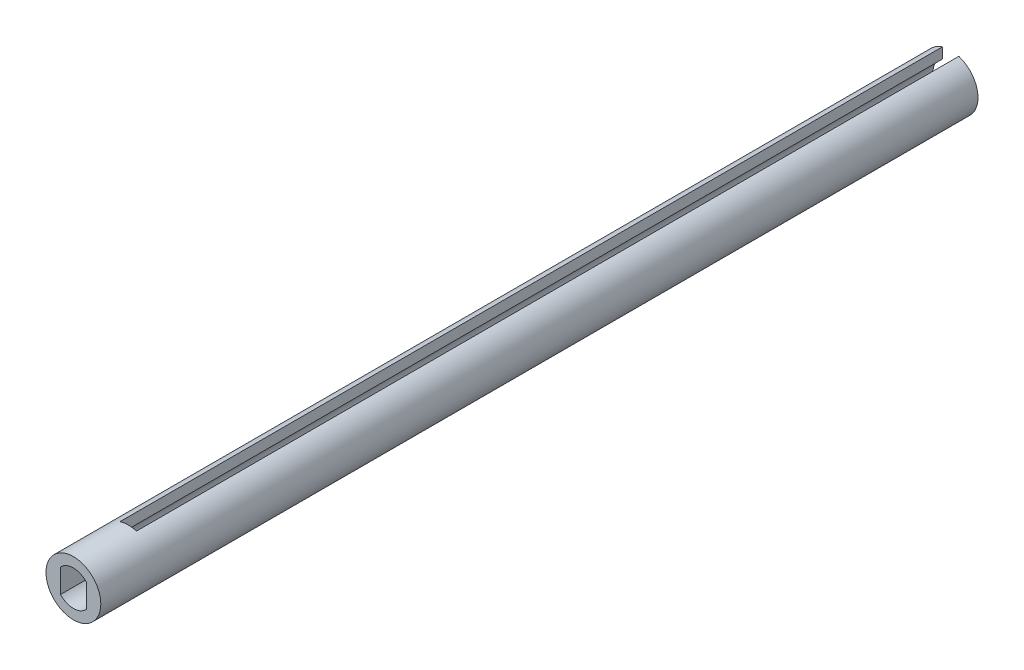
ISO-10303-21;
HEADER;
FILE_DESCRIPTION(('STEP AP214'),'2;1');
FILE_NAME('part.step','',(''),(''),'','','');
FILE_SCHEMA(('AUTOMOTIVE_DESIGN { 1 0 10303 214 1 1 1 1 }'));
ENDSEC;
DATA;
#1=APPLICATION_CONTEXT('core data for automotive mechanical design processes');
#2=APPLICATION_PROTOCOL_DEFINITION('international standard','automotive_design',2000,#1);
#3=PRODUCT_CONTEXT('',#1,'mechanical');
#4=PRODUCT('Part','Part','',(#3));
#5=PRODUCT_RELATED_PRODUCT_CATEGORY('part','',(#4));
#6=PRODUCT_DEFINITION_FORMATION('','',#4);
#7=PRODUCT_DEFINITION_CONTEXT('part definition',#1,'design');
#8=PRODUCT_DEFINITION('design','',#6,#7);
#9=PRODUCT_DEFINITION_SHAPE('','',#8);
#10=(LENGTH_UNIT() NAMED_UNIT(*) SI_UNIT(.MILLI.,.METRE.));
#11=(NAMED_UNIT(*) PLANE_ANGLE_UNIT() SI_UNIT($,.RADIAN.));
#12=(NAMED_UNIT(*) SI_UNIT($,.STERADIAN.) SOLID_ANGLE_UNIT());
#13=UNCERTAINTY_MEASURE_WITH_UNIT(LENGTH_MEASURE(1.E-05),#10,'distance_accuracy_value','');
#14=(GEOMETRIC_REPRESENTATION_CONTEXT(3) GLOBAL_UNCERTAINTY_ASSIGNED_CONTEXT((#13)) GLOBAL_UNIT_ASSIGNED_CONTEXT((#10,
#11,#12)) REPRESENTATION_CONTEXT('',''));
#15=CARTESIAN_POINT('',(0.,0.,0.));
#16=DIRECTION('',(0.,0.,1.));
#17=DIRECTION('',(1.,0.,0.));
#18=AXIS2_PLACEMENT_3D('',#15,#16,#17);
#19=CARTESIAN_POINT('',(0.,0.,0.));
#20=DIRECTION('',(0.,0.,1.));
#21=DIRECTION('',(1.,0.,0.));
#22=AXIS2_PLACEMENT_3D('',#19,#20,#21);
#23=PLANE('',#22);
#24=DIRECTION('',(0.,1.,0.));
#25=VECTOR('',#24,1.);
#26=CARTESIAN_POINT('',(1.5,0.,0.));
#27=LINE('',#26,#25);
#28=CARTESIAN_POINT('',(1.5,2.82665880502051,0.));
#29=VERTEX_POINT('',#28);
#30=CARTESIAN_POINT('',(1.5,4.76969600708473,0.));
#31=VERTEX_POINT('',#30);
#32=EDGE_CURVE('E129',#29,#31,#27,.T.);
#33=ORIENTED_EDGE('',*,*,#32,.T.);
#34=CARTESIAN_POINT('',(0.,0.,0.));
#35=DIRECTION('',(0.,0.,1.));
#36=DIRECTION('',(1.,0.,0.));
#37=AXIS2_PLACEMENT_3D('',#34,#35,#36);
#38=CIRCLE('',#37,5.);
#39=CARTESIAN_POINT('',(-1.5,4.76969600708473,0.));
#40=VERTEX_POINT('',#39);
#41=EDGE_CURVE('E163',#40,#31,#38,.T.);
#42=ORIENTED_EDGE('',*,*,#41,.F.);
#43=DIRECTION('',(0.,1.,0.));
#44=VECTOR('',#43,1.);
#45=CARTESIAN_POINT('',(-1.5,0.,0.));
#46=LINE('',#45,#44);
#47=CARTESIAN_POINT('',(-1.5,2.82665880502051,0.));
#48=VERTEX_POINT('',#47);
#49=EDGE_CURVE('E147',#48,#40,#46,.T.);
#50=ORIENTED_EDGE('',*,*,#49,.F.);
#51=CARTESIAN_POINT('',(0.,0.,0.));
#52=DIRECTION('',(0.,0.,1.));
#53=DIRECTION('',(1.,0.,0.));
#54=AXIS2_PLACEMENT_3D('',#51,#52,#53);
#55=CIRCLE('',#54,3.2);
#56=EDGE_CURVE('E135',#48,#29,#55,.T.);
#57=ORIENTED_EDGE('',*,*,#56,.T.);
#58=EDGE_LOOP('',(#33,#42,#50,#57));
#59=FACE_BOUND('',#58,.T.);
#60=ADVANCED_FACE('F47',(#59),#23,.F.);
#61=CARTESIAN_POINT('',(0.,0.,160.));
#62=DIRECTION('',(0.,0.,-1.));
#63=DIRECTION('',(-1.,0.,0.));
#64=AXIS2_PLACEMENT_3D('',#61,#62,#63);
#65=CYLINDRICAL_SURFACE('',#64,3.2);
#66=DIRECTION('',(0.,0.,-1.));
#67=VECTOR('',#66,1.);
#68=CARTESIAN_POINT('',(-2.35,2.17198066289735,160.));
#69=LINE('',#68,#67);
#70=CARTESIAN_POINT('',(-2.35,2.17198066289735,160.));
#71=VERTEX_POINT('',#70);
#72=CARTESIAN_POINT('',(-2.35,2.17198066289735,155.));
#73=VERTEX_POINT('',#72);
#74=EDGE_CURVE('E190',#71,#73,#69,.T.);
#75=ORIENTED_EDGE('',*,*,#74,.T.);
#76=CARTESIAN_POINT('',(-2.35,2.17198066289735,155.));
#77=CARTESIAN_POINT('',(-2.3499859631665,2.17196010913624,154.911714794234));
#78=CARTESIAN_POINT('',(-2.35233780267795,2.16944986870975,154.823423540656));
#79=CARTESIAN_POINT('',(-2.36167642687595,2.15929935983636,154.647342900407));
#80=CARTESIAN_POINT('',(-2.36866534656167,2.1516567283201,154.559553763709));
#81=CARTESIAN_POINT('',(-2.38727129151564,2.13099040907326,154.384224311997));
#82=CARTESIAN_POINT('',(-2.39893271426384,2.11791505498161,154.296694741332));
#83=CARTESIAN_POINT('',(-2.42666289015235,2.0860862607106,154.123388224814));
#84=CARTESIAN_POINT('',(-2.44273110053114,2.06733351975644,154.037611064523));
#85=CARTESIAN_POINT('',(-2.47902451295939,2.02367145338698,153.868126096642));
#86=CARTESIAN_POINT('',(-2.49926689973569,1.99873658798206,153.784428499551));
#87=CARTESIAN_POINT('',(-2.54338186881744,1.94229035924432,153.620274370416));
#88=CARTESIAN_POINT('',(-2.56725376915858,1.91078023095141,153.539817233094));
#89=CARTESIAN_POINT('',(-2.61785636015724,1.84083715326848,153.383354704468));
#90=CARTESIAN_POINT('',(-2.64457375691501,1.80243586789129,153.307330975165));
#91=CARTESIAN_POINT('',(-2.70006042452642,1.71820121535684,153.160370850191));
#92=CARTESIAN_POINT('',(-2.72882857563894,1.67237188686704,153.089431720056));
#93=CARTESIAN_POINT('',(-2.79756457768102,1.55553491445947,152.929917164909));
#94=CARTESIAN_POINT('',(-2.8379403557815,1.48131962901204,152.843815561099));
#95=CARTESIAN_POINT('',(-2.91710899444124,1.31857447197341,152.685406221096));
#96=CARTESIAN_POINT('',(-2.95590186239014,1.2300446672175,152.613098420503));
#97=CARTESIAN_POINT('',(-3.02830498824864,1.03915533030119,152.484356291823));
#98=CARTESIAN_POINT('',(-3.06187794591266,0.936705264679369,152.428034028228));
#99=CARTESIAN_POINT('',(-3.11965610748052,0.72119609209978,152.33405247564));
#100=CARTESIAN_POINT('',(-3.14387408266794,0.608151712373652,152.296367723137));
#101=CARTESIAN_POINT('',(-3.17440563669275,0.411976917455189,152.249561455427));
#102=CARTESIAN_POINT('',(-3.18395044409229,0.330554755965595,152.235192013338));
#103=CARTESIAN_POINT('',(-3.19674969915326,0.166099734315912,152.216001814944));
#104=CARTESIAN_POINT('',(-3.20000438725172,0.0830669358442565,152.211180693659));
#105=CARTESIAN_POINT('',(-3.19999420978506,-0.109630229456301,152.21118615179));
#106=CARTESIAN_POINT('',(-3.19431168397622,-0.219319920206776,152.219590899992));
#107=CARTESIAN_POINT('',(-3.17214693596162,-0.43505358215682,152.253014773771));
#108=CARTESIAN_POINT('',(-3.15565608777014,-0.541094570168152,152.27804716988));
#109=CARTESIAN_POINT('',(-3.1136170024631,-0.745845591648613,152.343956560529));
#110=CARTESIAN_POINT('',(-3.08809468792635,-0.844575638697687,152.384788238185));
#111=CARTESIAN_POINT('',(-3.03047231961144,-1.03242669810895,152.481109328255));
#112=CARTESIAN_POINT('',(-2.99837266564944,-1.12154829403691,152.536597849784));
#113=CARTESIAN_POINT('',(-2.93084005017882,-1.28769165170331,152.659935560569));
#114=CARTESIAN_POINT('',(-2.89544492049138,-1.36482882646534,152.727651232791));
#115=CARTESIAN_POINT('',(-2.82380561888736,-1.50748266179156,152.873924147776));
#116=CARTESIAN_POINT('',(-2.78756127702215,-1.57299697345059,152.9524835763));
#117=CARTESIAN_POINT('',(-2.71147648046165,-1.70124949931657,153.130571241499));
#118=CARTESIAN_POINT('',(-2.67187970092407,-1.7621980694888,153.231487423553));
#119=CARTESIAN_POINT('',(-2.59754164541057,-1.87004623626055,153.442225409882));
#120=CARTESIAN_POINT('',(-2.56280461553665,-1.91693358756802,153.552054871203));
#121=CARTESIAN_POINT('',(-2.49391728934554,-2.00603415845482,153.800733946871));
#122=CARTESIAN_POINT('',(-2.46126829169268,-2.04544600452006,153.941000096009));
#123=CARTESIAN_POINT('',(-2.40792314779446,-2.1079832690676,154.227278564585));
#124=CARTESIAN_POINT('',(-2.38722808043476,-2.13110721754923,154.373291401413));
#125=CARTESIAN_POINT('',(-2.3653767323975,-2.15525121287874,154.600092404938));
#126=CARTESIAN_POINT('',(-2.35961136454837,-2.16154656633332,154.679941780776));
#127=CARTESIAN_POINT('',(-2.35192507625534,-2.16989943345234,154.839854377547));
#128=CARTESIAN_POINT('',(-2.34999496614196,-2.17196707748656,154.919916625912));
#129=CARTESIAN_POINT('',(-2.35,-2.17198066289735,155.));
#130=B_SPLINE_CURVE_WITH_KNOTS('',3,(#76,#77,#78,#79,#80,#81,#82,#83,#84,#85,#86,#87,#88,#89,
#90,#91,#92,#93,#94,#95,#96,#97,#98,#99,#100,#101,#102,#103,#104,#105,#106,#107,#108,#109,#110,
#111,#112,#113,#114,#115,#116,#117,#118,#119,#120,#121,#122,#123,#124,#125,#126,#127,#128,#129),
.UNSPECIFIED.,.F.,.F.,(4,2,2,2,2,2,2,2,2,2,2,2,2,2,2,2,2,2,2,2,2,2,2,2,2,2,4),(0.,
0.264798466458638,0.529718935807124,0.797218713400203,1.06468555919648,1.33327635129154,
1.60181673897781,1.86915341896077,2.13634523114305,2.49668994422118,2.85703297487835,
3.21984303779325,3.58215603238182,3.83109628792892,4.08002702765666,4.40856128545382,
4.73735806209697,5.06521866350783,5.39305934119418,5.71751560394562,6.04203736269197,
6.41375872107456,6.78580286130069,7.23211364795381,7.67846470948686,7.91919873435269,
8.15935523696815),.UNSPECIFIED.);
#131=CARTESIAN_POINT('',(-2.35,-2.17198066289735,155.));
#132=VERTEX_POINT('',#131);
#133=EDGE_CURVE('E62',#73,#132,#130,.T.);
#134=ORIENTED_EDGE('',*,*,#133,.T.);
#135=DIRECTION('',(0.,0.,-1.));
#136=VECTOR('',#135,1.);
#137=CARTESIAN_POINT('',(-2.35,-2.17198066289735,160.));
#138=LINE('',#137,#136);
#139=CARTESIAN_POINT('',(-2.35,-2.17198066289735,160.));
#140=VERTEX_POINT('',#139);
#141=EDGE_CURVE('E175',#140,#132,#138,.T.);
#142=ORIENTED_EDGE('',*,*,#141,.F.);
#143=CARTESIAN_POINT('',(0.,0.,160.));
#144=DIRECTION('',(0.,0.,1.));
#145=DIRECTION('',(1.,0.,0.));
#146=AXIS2_PLACEMENT_3D('',#143,#144,#145);
#147=CIRCLE('',#146,3.2);
#148=CARTESIAN_POINT('',(2.35,-2.17198066289735,160.));
#149=VERTEX_POINT('',#148);
#150=EDGE_CURVE('E168',#140,#149,#147,.T.);
#151=ORIENTED_EDGE('',*,*,#150,.T.);
#152=DIRECTION('',(0.,0.,-1.));
#153=VECTOR('',#152,1.);
#154=CARTESIAN_POINT('',(2.35,-2.17198066289735,160.));
#155=LINE('',#154,#153);
#156=CARTESIAN_POINT('',(2.35,-2.17198066289735,155.));
#157=VERTEX_POINT('',#156);
#158=EDGE_CURVE('E184',#149,#157,#155,.T.);
#159=ORIENTED_EDGE('',*,*,#158,.T.);
#160=CARTESIAN_POINT('',(2.35,-2.17198066289735,155.));
#161=CARTESIAN_POINT('',(2.3499859631665,-2.17196010913624,154.911714794234));
#162=CARTESIAN_POINT('',(2.35233780267795,-2.16944986870975,154.823423540656));
#163=CARTESIAN_POINT('',(2.36167642687595,-2.15929935983636,154.647342900407));
#164=CARTESIAN_POINT('',(2.36866534656167,-2.1516567283201,154.559553763709));
#165=CARTESIAN_POINT('',(2.38727129151564,-2.13099040907326,154.384224311997));
#166=CARTESIAN_POINT('',(2.39893271426384,-2.11791505498161,154.296694741332));
#167=CARTESIAN_POINT('',(2.42666289015235,-2.0860862607106,154.123388224814));
#168=CARTESIAN_POINT('',(2.44273110053114,-2.06733351975644,154.037611064523));
#169=CARTESIAN_POINT('',(2.47902451295939,-2.02367145338698,153.868126096642));
#170=CARTESIAN_POINT('',(2.49926689973569,-1.99873658798206,153.784428499551));
#171=CARTESIAN_POINT('',(2.54338186881744,-1.94229035924432,153.620274370416));
#172=CARTESIAN_POINT('',(2.56725376915858,-1.91078023095141,153.539817233094));
#173=CARTESIAN_POINT('',(2.61785636015724,-1.84083715326848,153.383354704468));
#174=CARTESIAN_POINT('',(2.64457375691501,-1.80243586789129,153.307330975165));
#175=CARTESIAN_POINT('',(2.70006042452642,-1.71820121535684,153.160370850191));
#176=CARTESIAN_POINT('',(2.72882857563894,-1.67237188686704,153.089431720056));
#177=CARTESIAN_POINT('',(2.79756457768102,-1.55553491445947,152.929917164909));
#178=CARTESIAN_POINT('',(2.8379403557815,-1.48131962901204,152.843815561099));
#179=CARTESIAN_POINT('',(2.91710899444124,-1.31857447197341,152.685406221096));
#180=CARTESIAN_POINT('',(2.95590186239014,-1.2300446672175,152.613098420503));
#181=CARTESIAN_POINT('',(3.02830498824864,-1.03915533030119,152.484356291823));
#182=CARTESIAN_POINT('',(3.06187794591266,-0.936705264679369,152.428034028228));
#183=CARTESIAN_POINT('',(3.11965610748052,-0.721196092099781,152.33405247564));
#184=CARTESIAN_POINT('',(3.14387408266794,-0.608151712373653,152.296367723137));
#185=CARTESIAN_POINT('',(3.17440563669275,-0.411976917455189,152.249561455427));
#186=CARTESIAN_POINT('',(3.18395044409229,-0.330554755965595,152.235192013338));
#187=CARTESIAN_POINT('',(3.19674969915326,-0.166099734315912,152.216001814944));
#188=CARTESIAN_POINT('',(3.20000438725172,-0.0830669358442568,152.211180693659));
#189=CARTESIAN_POINT('',(3.19999420978506,0.109630229456299,152.21118615179));
#190=CARTESIAN_POINT('',(3.19431168397622,0.219319920206773,152.219590899992));
#191=CARTESIAN_POINT('',(3.17214693596162,0.435053582156817,152.253014773771));
#192=CARTESIAN_POINT('',(3.15565608777014,0.541094570168151,152.27804716988));
#193=CARTESIAN_POINT('',(3.1136170024631,0.745845591648613,152.343956560529));
#194=CARTESIAN_POINT('',(3.08809468792635,0.844575638697686,152.384788238185));
#195=CARTESIAN_POINT('',(3.03047231961144,1.03242669810895,152.481109328255));
#196=CARTESIAN_POINT('',(2.99837266564944,1.12154829403691,152.536597849784));
#197=CARTESIAN_POINT('',(2.93084005017882,1.28769165170331,152.659935560569));
#198=CARTESIAN_POINT('',(2.89544492049138,1.36482882646533,152.727651232791));
#199=CARTESIAN_POINT('',(2.82380561888736,1.50748266179155,152.873924147776));
#200=CARTESIAN_POINT('',(2.78756127702216,1.57299697345059,152.9524835763));
#201=CARTESIAN_POINT('',(2.71147648046166,1.70124949931657,153.130571241499));
#202=CARTESIAN_POINT('',(2.67187970092407,1.7621980694888,153.231487423553));
#203=CARTESIAN_POINT('',(2.59754164541057,1.87004623626055,153.442225409882));
#204=CARTESIAN_POINT('',(2.56280461553664,1.91693358756802,153.552054871203));
#205=CARTESIAN_POINT('',(2.49391728934554,2.00603415845482,153.800733946871));
#206=CARTESIAN_POINT('',(2.46126829169268,2.04544600452006,153.941000096009));
#207=CARTESIAN_POINT('',(2.40792314779446,2.1079832690676,154.227278564585));
#208=CARTESIAN_POINT('',(2.38722808043476,2.13110721754922,154.373291401413));
#209=CARTESIAN_POINT('',(2.3653767323975,2.15525121287874,154.600092404938));
#210=CARTESIAN_POINT('',(2.35961136454837,2.16154656633332,154.679941780776));
#211=CARTESIAN_POINT('',(2.35192507625534,2.16989943345234,154.839854377547));
#212=CARTESIAN_POINT('',(2.34999496614196,2.17196707748656,154.919916625912));
#213=CARTESIAN_POINT('',(2.35,2.17198066289735,155.));
#214=B_SPLINE_CURVE_WITH_KNOTS('',3,(#160,#161,#162,#163,#164,#165,#166,#167,#168,#169,#170,
#171,#172,#173,#174,#175,#176,#177,#178,#179,#180,#181,#182,#183,#184,#185,#186,#187,#188,#189,
#190,#191,#192,#193,#194,#195,#196,#197,#198,#199,#200,#201,#202,#203,#204,#205,#206,#207,#208,
#209,#210,#211,#212,#213),.UNSPECIFIED.,.F.,.F.,(4,2,2,2,2,2,2,2,2,2,2,2,2,2,2,2,2,2,2,2,2,2,2,
2,2,2,4),(0.,0.264798466458638,0.529718935807124,0.797218713400203,1.06468555919648,
1.33327635129154,1.60181673897781,1.86915341896077,2.13634523114305,2.49668994422118,
2.85703297487835,3.21984303779325,3.58215603238182,3.83109628792892,4.08002702765666,
4.40856128545382,4.73735806209697,5.06521866350783,5.39305934119418,5.71751560394562,
6.04203736269197,6.41375872107456,6.78580286130069,7.23211364795381,7.67846470948686,
7.91919873435269,8.15935523696815),.UNSPECIFIED.);
#215=CARTESIAN_POINT('',(2.35,2.17198066289735,155.));
#216=VERTEX_POINT('',#215);
#217=EDGE_CURVE('E11',#157,#216,#214,.T.);
#218=ORIENTED_EDGE('',*,*,#217,.T.);
#219=DIRECTION('',(0.,0.,-1.));
#220=VECTOR('',#219,1.);
#221=CARTESIAN_POINT('',(2.35,2.17198066289735,160.));
#222=LINE('',#221,#220);
#223=CARTESIAN_POINT('',(2.35,2.17198066289735,160.));
#224=VERTEX_POINT('',#223);
#225=EDGE_CURVE('E187',#224,#216,#222,.T.);
#226=ORIENTED_EDGE('',*,*,#225,.F.);
#227=EDGE_CURVE('E162',#224,#71,#147,.T.);
#228=ORIENTED_EDGE('',*,*,#227,.T.);
#229=EDGE_LOOP('',(#75,#134,#142,#151,#159,#218,#226,#228));
#230=FACE_BOUND('',#229,.T.);
#231=CARTESIAN_POINT('',(0.,0.,150.));
#232=DIRECTION('',(0.,0.,1.));
#233=DIRECTION('',(1.,0.,0.));
#234=AXIS2_PLACEMENT_3D('',#231,#232,#233);
#235=CIRCLE('',#234,3.2);
#236=CARTESIAN_POINT('',(1.5,2.82665880502051,150.));
#237=VERTEX_POINT('',#236);
#238=CARTESIAN_POINT('',(-1.5,2.82665880502051,150.));
#239=VERTEX_POINT('',#238);
#240=EDGE_CURVE('E139',#237,#239,#235,.T.);
#241=ORIENTED_EDGE('',*,*,#240,.F.);
#242=DIRECTION('',(0.,0.,-1.));
#243=VECTOR('',#242,1.);
#244=CARTESIAN_POINT('',(1.5,2.82665880502051,150.));
#245=LINE('',#244,#243);
#246=EDGE_CURVE('E123',#237,#29,#245,.T.);
#247=ORIENTED_EDGE('',*,*,#246,.T.);
#248=ORIENTED_EDGE('',*,*,#56,.F.);
#249=DIRECTION('',(0.,0.,-1.));
#250=VECTOR('',#249,1.);
#251=CARTESIAN_POINT('',(-1.5,2.82665880502051,150.));
#252=LINE('',#251,#250);
#253=EDGE_CURVE('E136',#239,#48,#252,.T.);
#254=ORIENTED_EDGE('',*,*,#253,.F.);
#255=EDGE_LOOP('',(#241,#247,#248,#254));
#256=FACE_BOUND('',#255,.T.);
#257=ADVANCED_FACE('F145',(#230,#256),#65,.F.);
#258=CARTESIAN_POINT('',(0.,0.,160.));
#259=DIRECTION('',(0.,0.,-1.));
#260=DIRECTION('',(-1.,0.,0.));
#261=AXIS2_PLACEMENT_3D('',#258,#259,#260);
#262=CYLINDRICAL_SURFACE('',#261,5.);
#263=CARTESIAN_POINT('',(0.,0.,160.));
#264=DIRECTION('',(0.,0.,1.));
#265=DIRECTION('',(1.,0.,0.));
#266=AXIS2_PLACEMENT_3D('',#263,#264,#265);
#267=CIRCLE('',#266,5.);
#268=CARTESIAN_POINT('',(5.,0.,160.));
#269=VERTEX_POINT('',#268);
#270=EDGE_CURVE('E171',#269,#269,#267,.T.);
#271=ORIENTED_EDGE('',*,*,#270,.F.);
#272=EDGE_LOOP('',(#271));
#273=FACE_BOUND('',#272,.T.);
#274=DIRECTION('',(0.,0.,-1.));
#275=VECTOR('',#274,1.);
#276=CARTESIAN_POINT('',(1.5,4.76969600708473,160.));
#277=LINE('',#276,#275);
#278=CARTESIAN_POINT('',(1.5,4.76969600708473,150.));
#279=VERTEX_POINT('',#278);
#280=EDGE_CURVE('E200',#279,#31,#277,.T.);
#281=ORIENTED_EDGE('',*,*,#280,.F.);
#282=CARTESIAN_POINT('',(0.,0.,150.));
#283=DIRECTION('',(0.,0.,1.));
#284=DIRECTION('',(1.,0.,0.));
#285=AXIS2_PLACEMENT_3D('',#282,#283,#284);
#286=CIRCLE('',#285,5.);
#287=CARTESIAN_POINT('',(-1.5,4.76969600708473,150.));
#288=VERTEX_POINT('',#287);
#289=EDGE_CURVE('E141',#279,#288,#286,.T.);
#290=ORIENTED_EDGE('',*,*,#289,.T.);
#291=DIRECTION('',(0.,0.,-1.));
#292=VECTOR('',#291,1.);
#293=CARTESIAN_POINT('',(-1.5,4.76969600708473,160.));
#294=LINE('',#293,#292);
#295=EDGE_CURVE('E196',#288,#40,#294,.T.);
#296=ORIENTED_EDGE('',*,*,#295,.T.);
#297=ORIENTED_EDGE('',*,*,#41,.T.);
#298=EDGE_LOOP('',(#281,#290,#296,#297));
#299=FACE_BOUND('',#298,.T.);
#300=ADVANCED_FACE('F220',(#273,#299),#262,.T.);
#301=CARTESIAN_POINT('',(-2.35,0.,160.));
#302=DIRECTION('',(1.,0.,0.));
#303=DIRECTION('',(0.,1.,0.));
#304=AXIS2_PLACEMENT_3D('',#301,#302,#303);
#305=PLANE('',#304);
#306=ORIENTED_EDGE('',*,*,#141,.T.);
#307=DIRECTION('',(0.,-1.,0.));
#308=VECTOR('',#307,1.);
#309=CARTESIAN_POINT('',(-2.35,2.17198066289735,155.));
#310=LINE('',#309,#308);
#311=EDGE_CURVE('E203',#132,#73,#310,.F.);
#312=ORIENTED_EDGE('',*,*,#311,.T.);
#313=ORIENTED_EDGE('',*,*,#74,.F.);
#314=DIRECTION('',(0.,-1.,0.));
#315=VECTOR('',#314,1.);
#316=CARTESIAN_POINT('',(-2.35,0.,160.));
#317=LINE('',#316,#315);
#318=EDGE_CURVE('E158',#71,#140,#317,.T.);
#319=ORIENTED_EDGE('',*,*,#318,.T.);
#320=EDGE_LOOP('',(#306,#312,#313,#319));
#321=FACE_BOUND('',#320,.T.);
#322=ADVANCED_FACE('F226',(#321),#305,.T.);
#323=CARTESIAN_POINT('',(2.35,0.,160.));
#324=DIRECTION('',(1.,0.,0.));
#325=DIRECTION('',(0.,0.,-1.));
#326=AXIS2_PLACEMENT_3D('',#323,#324,#325);
#327=PLANE('',#326);
#328=ORIENTED_EDGE('',*,*,#225,.T.);
#329=DIRECTION('',(0.,-1.,0.));
#330=VECTOR('',#329,1.);
#331=CARTESIAN_POINT('',(2.35,0.,155.));
#332=LINE('',#331,#330);
#333=EDGE_CURVE('E206',#216,#157,#332,.T.);
#334=ORIENTED_EDGE('',*,*,#333,.T.);
#335=ORIENTED_EDGE('',*,*,#158,.F.);
#336=DIRECTION('',(0.,-1.,0.));
#337=VECTOR('',#336,1.);
#338=CARTESIAN_POINT('',(2.35,0.,160.));
#339=LINE('',#338,#337);
#340=EDGE_CURVE('E167',#224,#149,#339,.T.);
#341=ORIENTED_EDGE('',*,*,#340,.F.);
#342=EDGE_LOOP('',(#328,#334,#335,#341));
#343=FACE_BOUND('',#342,.T.);
#344=ADVANCED_FACE('F222',(#343),#327,.F.);
#345=CARTESIAN_POINT('',(0.,0.,160.));
#346=DIRECTION('',(0.,0.,1.));
#347=DIRECTION('',(1.,0.,0.));
#348=AXIS2_PLACEMENT_3D('',#345,#346,#347);
#349=PLANE('',#348);
#350=ORIENTED_EDGE('',*,*,#318,.F.);
#351=ORIENTED_EDGE('',*,*,#227,.F.);
#352=ORIENTED_EDGE('',*,*,#340,.T.);
#353=ORIENTED_EDGE('',*,*,#150,.F.);
#354=EDGE_LOOP('',(#350,#351,#352,#353));
#355=FACE_BOUND('',#354,.T.);
#356=ORIENTED_EDGE('',*,*,#270,.T.);
#357=EDGE_LOOP('',(#356));
#358=FACE_BOUND('',#357,.T.);
#359=ADVANCED_FACE('F225',(#355,#358),#349,.T.);
#360=CARTESIAN_POINT('',(1.5,0.,150.));
#361=DIRECTION('',(-1.,0.,0.));
#362=DIRECTION('',(0.,0.,1.));
#363=AXIS2_PLACEMENT_3D('',#360,#361,#362);
#364=PLANE('',#363);
#365=ORIENTED_EDGE('',*,*,#280,.T.);
#366=ORIENTED_EDGE('',*,*,#32,.F.);
#367=ORIENTED_EDGE('',*,*,#246,.F.);
#368=DIRECTION('',(0.,1.,0.));
#369=VECTOR('',#368,1.);
#370=CARTESIAN_POINT('',(1.5,0.,150.));
#371=LINE('',#370,#369);
#372=EDGE_CURVE('E126',#237,#279,#371,.T.);
#373=ORIENTED_EDGE('',*,*,#372,.T.);
#374=EDGE_LOOP('',(#365,#366,#367,#373));
#375=FACE_BOUND('',#374,.T.);
#376=ADVANCED_FACE('F125',(#375),#364,.T.);
#377=CARTESIAN_POINT('',(-1.5,0.,150.));
#378=DIRECTION('',(-1.,0.,0.));
#379=DIRECTION('',(0.,0.,1.));
#380=AXIS2_PLACEMENT_3D('',#377,#378,#379);
#381=PLANE('',#380);
#382=DIRECTION('',(0.,1.,0.));
#383=VECTOR('',#382,1.);
#384=CARTESIAN_POINT('',(-1.5,0.,150.));
#385=LINE('',#384,#383);
#386=EDGE_CURVE('E89',#239,#288,#385,.T.);
#387=ORIENTED_EDGE('',*,*,#386,.F.);
#388=ORIENTED_EDGE('',*,*,#253,.T.);
#389=ORIENTED_EDGE('',*,*,#49,.T.);
#390=ORIENTED_EDGE('',*,*,#295,.F.);
#391=EDGE_LOOP('',(#387,#388,#389,#390));
#392=FACE_BOUND('',#391,.T.);
#393=ADVANCED_FACE('F244',(#392),#381,.F.);
#394=CARTESIAN_POINT('',(0.,0.,150.));
#395=DIRECTION('',(0.,0.,1.));
#396=DIRECTION('',(1.,0.,0.));
#397=AXIS2_PLACEMENT_3D('',#394,#395,#396);
#398=PLANE('',#397);
#399=ORIENTED_EDGE('',*,*,#372,.F.);
#400=ORIENTED_EDGE('',*,*,#240,.T.);
#401=ORIENTED_EDGE('',*,*,#386,.T.);
#402=ORIENTED_EDGE('',*,*,#289,.F.);
#403=EDGE_LOOP('',(#399,#400,#401,#402));
#404=FACE_BOUND('',#403,.T.);
#405=ADVANCED_FACE('F138',(#404),#398,.F.);
#406=CARTESIAN_POINT('',(-7.35,0.,155.));
#407=DIRECTION('',(0.,1.,0.));
#408=DIRECTION('',(-1.,0.,0.));
#409=AXIS2_PLACEMENT_3D('',#406,#407,#408);
#410=CYLINDRICAL_SURFACE('',#409,5.);
#411=ORIENTED_EDGE('',*,*,#133,.F.);
#412=ORIENTED_EDGE('',*,*,#311,.F.);
#413=EDGE_LOOP('',(#411,#412));
#414=FACE_BOUND('',#413,.T.);
#415=ADVANCED_FACE('F213',(#414),#410,.T.);
#416=CARTESIAN_POINT('',(7.35,0.,155.));
#417=DIRECTION('',(0.,-1.,0.));
#418=DIRECTION('',(0.,0.,-1.));
#419=AXIS2_PLACEMENT_3D('',#416,#417,#418);
#420=CYLINDRICAL_SURFACE('',#419,5.);
#421=ORIENTED_EDGE('',*,*,#333,.F.);
#422=ORIENTED_EDGE('',*,*,#217,.F.);
#423=EDGE_LOOP('',(#421,#422));
#424=FACE_BOUND('',#423,.T.);
#425=ADVANCED_FACE('F49',(#424),#420,.T.);
#426=CLOSED_SHELL('',(#60,#257,#300,#322,#344,#359,#376,#393,#405,#415,#425));
#427=MANIFOLD_SOLID_BREP('B2',#426);
#428=ADVANCED_BREP_SHAPE_REPRESENTATION('',(#18,#427),#14);
#429=SHAPE_DEFINITION_REPRESENTATION(#9,#428);
ENDSEC;
END-ISO-10303-21;
